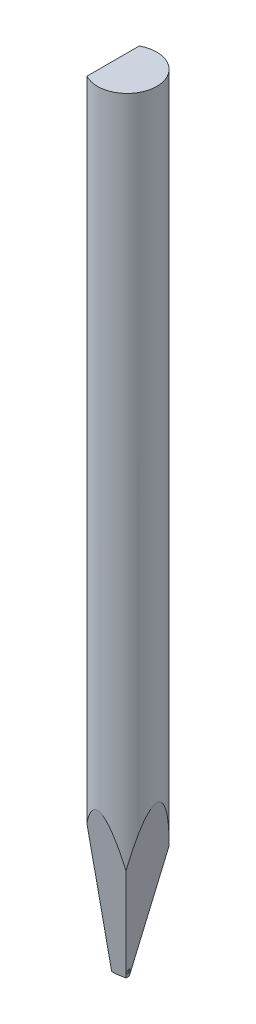
ISO-10303-21;
HEADER;
FILE_DESCRIPTION(('STEP AP214'),'2;1');
FILE_NAME('part.step','',(''),(''),'','','');
FILE_SCHEMA(('AUTOMOTIVE_DESIGN { 1 0 10303 214 1 1 1 1 }'));
ENDSEC;
DATA;
#1=APPLICATION_CONTEXT('core data for automotive mechanical design processes');
#2=APPLICATION_PROTOCOL_DEFINITION('international standard','automotive_design',2000,#1);
#3=PRODUCT_CONTEXT('',#1,'mechanical');
#4=PRODUCT('Part','Part','',(#3));
#5=PRODUCT_RELATED_PRODUCT_CATEGORY('part','',(#4));
#6=PRODUCT_DEFINITION_FORMATION('','',#4);
#7=PRODUCT_DEFINITION_CONTEXT('part definition',#1,'design');
#8=PRODUCT_DEFINITION('design','',#6,#7);
#9=PRODUCT_DEFINITION_SHAPE('','',#8);
#10=(LENGTH_UNIT() NAMED_UNIT(*) SI_UNIT(.MILLI.,.METRE.));
#11=(NAMED_UNIT(*) PLANE_ANGLE_UNIT() SI_UNIT($,.RADIAN.));
#12=(NAMED_UNIT(*) SI_UNIT($,.STERADIAN.) SOLID_ANGLE_UNIT());
#13=UNCERTAINTY_MEASURE_WITH_UNIT(LENGTH_MEASURE(1.E-05),#10,'distance_accuracy_value','');
#14=(GEOMETRIC_REPRESENTATION_CONTEXT(3) GLOBAL_UNCERTAINTY_ASSIGNED_CONTEXT((#13)) GLOBAL_UNIT_ASSIGNED_CONTEXT((#10,
#11,#12)) REPRESENTATION_CONTEXT('',''));
#15=CARTESIAN_POINT('',(0.,0.,0.));
#16=DIRECTION('',(0.,0.,1.));
#17=DIRECTION('',(1.,0.,0.));
#18=AXIS2_PLACEMENT_3D('',#15,#16,#17);
#19=CARTESIAN_POINT('',(0.,21.0312,0.));
#20=DIRECTION('',(0.,-1.,0.));
#21=DIRECTION('',(0.,0.,-1.));
#22=AXIS2_PLACEMENT_3D('',#19,#20,#21);
#23=CYLINDRICAL_SURFACE('',#22,0.792479999999998);
#24=CARTESIAN_POINT('',(0.,-0.201670781505604,0.));
#25=DIRECTION('',(0.,-0.173648177666931,0.984807753012208));
#26=DIRECTION('',(0.,-0.984807753012208,-0.173648177666931));
#27=AXIS2_PLACEMENT_3D('',#24,#25,#26);
#28=ELLIPSE('',#27,4.56371043248163,0.792479999999998);
#29=CARTESIAN_POINT('',(0.544920706940428,3.06158878676079,0.575400706940426));
#30=VERTEX_POINT('',#29);
#31=CARTESIAN_POINT('',(-0.37592,3.75487126564512,0.69764511322018));
#32=VERTEX_POINT('',#31);
#33=EDGE_CURVE('E277',#30,#32,#28,.T.);
#34=ORIENTED_EDGE('',*,*,#33,.F.);
#35=CARTESIAN_POINT('',(0.,-0.0288101116436568,0.));
#36=DIRECTION('',(-0.984807753012208,0.173648177666931,0.));
#37=DIRECTION('',(-0.173648177666931,-0.984807753012208,0.));
#38=AXIS2_PLACEMENT_3D('',#35,#36,#37);
#39=ELLIPSE('',#38,4.56371043248164,0.792479999999998);
#40=CARTESIAN_POINT('',(0.544920706940428,3.06158878676079,-0.575400706940426));
#41=VERTEX_POINT('',#40);
#42=EDGE_CURVE('E280',#30,#41,#39,.T.);
#43=ORIENTED_EDGE('',*,*,#42,.T.);
#44=CARTESIAN_POINT('',(0.,-0.201670781505604,0.));
#45=DIRECTION('',(0.,-0.173648177666931,-0.984807753012208));
#46=DIRECTION('',(0.,-0.984807753012208,0.173648177666931));
#47=AXIS2_PLACEMENT_3D('',#44,#45,#46);
#48=ELLIPSE('',#47,4.56371043248163,0.792479999999998);
#49=CARTESIAN_POINT('',(-0.37592,3.75487126564511,-0.69764511322018));
#50=VERTEX_POINT('',#49);
#51=EDGE_CURVE('E285',#50,#41,#48,.T.);
#52=ORIENTED_EDGE('',*,*,#51,.F.);
#53=DIRECTION('',(0.,-1.,0.));
#54=VECTOR('',#53,1.);
#55=CARTESIAN_POINT('',(-0.37592,21.0312,-0.69764511322018));
#56=LINE('',#55,#54);
#57=CARTESIAN_POINT('',(-0.37592,21.0312,-0.69764511322018));
#58=VERTEX_POINT('',#57);
#59=EDGE_CURVE('E302',#58,#50,#56,.T.);
#60=ORIENTED_EDGE('',*,*,#59,.F.);
#61=CARTESIAN_POINT('',(0.,21.0312,0.));
#62=DIRECTION('',(0.,1.,0.));
#63=DIRECTION('',(0.,0.,1.));
#64=AXIS2_PLACEMENT_3D('',#61,#62,#63);
#65=CIRCLE('',#64,0.792479999999998);
#66=CARTESIAN_POINT('',(-0.37592,21.0312,0.69764511322018));
#67=VERTEX_POINT('',#66);
#68=EDGE_CURVE('E305',#67,#58,#65,.T.);
#69=ORIENTED_EDGE('',*,*,#68,.F.);
#70=DIRECTION('',(0.,-1.,0.));
#71=VECTOR('',#70,1.);
#72=CARTESIAN_POINT('',(-0.37592,21.0312,0.69764511322018));
#73=LINE('',#72,#71);
#74=EDGE_CURVE('E283',#32,#67,#73,.F.);
#75=ORIENTED_EDGE('',*,*,#74,.F.);
#76=EDGE_LOOP('',(#34,#43,#52,#60,#69,#75));
#77=FACE_BOUND('',#76,.T.);
#78=ADVANCED_FACE('F46',(#77),#23,.T.);
#79=CARTESIAN_POINT('',(-0.37592,21.0312,-0.80247998));
#80=DIRECTION('',(-1.,0.,0.));
#81=DIRECTION('',(0.,0.,1.));
#82=AXIS2_PLACEMENT_3D('',#79,#80,#81);
#83=PLANE('',#82);
#84=DIRECTION('',(0.,-0.984807753012208,0.173648177666931));
#85=VECTOR('',#84,1.);
#86=CARTESIAN_POINT('',(-0.37592,20.5281827638758,-3.65523248618578));
#87=LINE('',#86,#85);
#88=CARTESIAN_POINT('',(-0.375919999999999,0.,-0.0355486570961345));
#89=VERTEX_POINT('',#88);
#90=EDGE_CURVE('E311',#50,#89,#87,.T.);
#91=ORIENTED_EDGE('',*,*,#90,.T.);
#92=CARTESIAN_POINT('',(-0.37592,0.,0.0355373141922684));
#93=CARTESIAN_POINT('',(-0.37592,0.0123359586796348,0.0261254448351633));
#94=CARTESIAN_POINT('',(-0.37592,0.0241300000000007,0.013381408455424));
#95=CARTESIAN_POINT('',(-0.37592,0.0241300000000007,-0.0133814084554238));
#96=CARTESIAN_POINT('',(-0.37592,0.0123359586796344,-0.026125444835163));
#97=CARTESIAN_POINT('',(-0.37592,0.,-0.0355373141922685));
#98=(BOUNDED_CURVE() B_SPLINE_CURVE(3,(#92,#93,#94,#95,#96,#97),.UNSPECIFIED.,.F.,
.F.) B_SPLINE_CURVE_WITH_KNOTS((4,2,4),(1.35718974229686,1.5707963267949,1.78440291129293),
.UNSPECIFIED.) CURVE() GEOMETRIC_REPRESENTATION_ITEM() RATIONAL_B_SPLINE_CURVE((1.,1.,1.,1.,1.,1.)) REPRESENTATION_ITEM(''));
#99=CARTESIAN_POINT('',(-0.375919999999998,0.,0.0355486570961342));
#100=VERTEX_POINT('',#99);
#101=EDGE_CURVE('E12',#89,#100,#98,.F.);
#102=ORIENTED_EDGE('',*,*,#101,.T.);
#103=DIRECTION('',(0.,0.984807753012208,0.173648177666931));
#104=VECTOR('',#103,1.);
#105=CARTESIAN_POINT('',(-0.37592,20.2537184461002,3.60683702172021));
#106=LINE('',#105,#104);
#107=EDGE_CURVE('E308',#100,#32,#106,.T.);
#108=ORIENTED_EDGE('',*,*,#107,.T.);
#109=ORIENTED_EDGE('',*,*,#74,.T.);
#110=DIRECTION('',(0.,0.,-1.));
#111=VECTOR('',#110,1.);
#112=CARTESIAN_POINT('',(-0.37592,21.0312,-0.80247998));
#113=LINE('',#112,#111);
#114=EDGE_CURVE('E299',#67,#58,#113,.T.);
#115=ORIENTED_EDGE('',*,*,#114,.T.);
#116=ORIENTED_EDGE('',*,*,#59,.T.);
#117=EDGE_LOOP('',(#91,#102,#108,#109,#115,#116));
#118=FACE_BOUND('',#117,.T.);
#119=ADVANCED_FACE('F253',(#118),#83,.T.);
#120=CARTESIAN_POINT('',(0.,21.0312,0.));
#121=DIRECTION('',(0.,1.,0.));
#122=DIRECTION('',(0.,0.,1.));
#123=AXIS2_PLACEMENT_3D('',#120,#121,#122);
#124=PLANE('',#123);
#125=ORIENTED_EDGE('',*,*,#68,.T.);
#126=ORIENTED_EDGE('',*,*,#114,.F.);
#127=EDGE_LOOP('',(#125,#126));
#128=FACE_BOUND('',#127,.T.);
#129=ADVANCED_FACE('F263',(#128),#124,.T.);
#130=CARTESIAN_POINT('',(26.8738719491216,0.,0.03556));
#131=DIRECTION('',(0.,-0.173648177666931,0.984807753012208));
#132=DIRECTION('',(0.,-0.984807753012208,-0.173648177666931));
#133=AXIS2_PLACEMENT_3D('',#130,#131,#132);
#134=PLANE('',#133);
#135=DIRECTION('',(-0.984346441568213,-0.173566836012845,-0.0306045161452665));
#136=VECTOR('',#135,1.);
#137=CARTESIAN_POINT('',(26.0308292513306,4.63696393297968,0.853181849956361));
#138=LINE('',#137,#136);
#139=CARTESIAN_POINT('',(0.0138011175017547,0.0494599151344343,0.0442811175017518));
#140=VERTEX_POINT('',#139);
#141=CARTESIAN_POINT('',(-0.266700000000001,0.,0.0355486570961342));
#142=VERTEX_POINT('',#141);
#143=EDGE_CURVE('E75',#140,#142,#138,.T.);
#144=ORIENTED_EDGE('',*,*,#143,.F.);
#145=DIRECTION('',(-0.171087869746036,-0.970287525247814,-0.171087869746036));
#146=VECTOR('',#145,1.);
#147=CARTESIAN_POINT('',(0.791557999082992,4.46033837772866,0.822037999082991));
#148=LINE('',#147,#146);
#149=EDGE_CURVE('E290',#30,#140,#148,.T.);
#150=ORIENTED_EDGE('',*,*,#149,.F.);
#151=ORIENTED_EDGE('',*,*,#33,.T.);
#152=ORIENTED_EDGE('',*,*,#107,.F.);
#153=CARTESIAN_POINT('',(-0.266700000000002,0.,0.0355373141922684));
#154=DIRECTION('',(-1.,0.,0.));
#155=VECTOR('',#154,1.);
#156=LINE('',#153,#155);
#157=EDGE_CURVE('E331',#142,#100,#156,.T.);
#158=ORIENTED_EDGE('',*,*,#157,.F.);
#159=EDGE_LOOP('',(#144,#150,#151,#152,#158));
#160=FACE_BOUND('',#159,.T.);
#161=ADVANCED_FACE('F268',(#160),#134,.T.);
#162=CARTESIAN_POINT('',(26.8738719491216,0.,-0.03556));
#163=DIRECTION('',(0.,-0.173648177666931,-0.984807753012208));
#164=DIRECTION('',(0.,0.984807753012208,-0.173648177666931));
#165=AXIS2_PLACEMENT_3D('',#162,#163,#164);
#166=PLANE('',#165);
#167=DIRECTION('',(0.984346441568213,0.173566836012845,-0.0306045161452665));
#168=VECTOR('',#167,1.);
#169=CARTESIAN_POINT('',(26.0308292513306,4.63696393297968,-0.853181849956361));
#170=LINE('',#169,#168);
#171=CARTESIAN_POINT('',(-0.266700000000003,0.,-0.0355486570961342));
#172=VERTEX_POINT('',#171);
#173=CARTESIAN_POINT('',(0.0138011175017547,0.0494599151344343,-0.0442811175017518));
#174=VERTEX_POINT('',#173);
#175=EDGE_CURVE('E310',#172,#174,#170,.T.);
#176=ORIENTED_EDGE('',*,*,#175,.F.);
#177=CARTESIAN_POINT('',(-0.266699999999998,0.,-0.0355600000000001));
#178=DIRECTION('',(-1.,0.,0.));
#179=VECTOR('',#178,1.);
#180=LINE('',#177,#179);
#181=EDGE_CURVE('E286',#172,#89,#180,.T.);
#182=ORIENTED_EDGE('',*,*,#181,.T.);
#183=ORIENTED_EDGE('',*,*,#90,.F.);
#184=ORIENTED_EDGE('',*,*,#51,.T.);
#185=DIRECTION('',(0.171087869746036,0.970287525247814,-0.171087869746036));
#186=VECTOR('',#185,1.);
#187=CARTESIAN_POINT('',(0.791557999082992,4.46033837772866,-0.822037999082991));
#188=LINE('',#187,#186);
#189=EDGE_CURVE('E292',#174,#41,#188,.T.);
#190=ORIENTED_EDGE('',*,*,#189,.F.);
#191=EDGE_LOOP('',(#176,#182,#183,#184,#190));
#192=FACE_BOUND('',#191,.T.);
#193=ADVANCED_FACE('F264',(#192),#166,.T.);
#194=CARTESIAN_POINT('',(-0.2667,0.,27.2760283406468));
#195=DIRECTION('',(-0.173648177666931,0.984807753012208,0.));
#196=DIRECTION('',(-0.984807753012208,-0.173648177666931,0.));
#197=AXIS2_PLACEMENT_3D('',#194,#195,#196);
#198=PLANE('',#197);
#199=CARTESIAN_POINT('',(-1.19582610050797,-0.16383,0.));
#200=DIRECTION('',(-0.173648177666931,0.984807753012208,0.));
#201=DIRECTION('',(-0.984807753012208,-0.173648177666931,0.));
#202=AXIS2_PLACEMENT_3D('',#199,#200,#201);
#203=ELLIPSE('',#202,0.965400283794194,0.16764);
#204=CARTESIAN_POINT('',(-0.258999947357658,0.00135772703372089,0.0285689418325727));
#205=VERTEX_POINT('',#204);
#206=EDGE_CURVE('E218',#142,#205,#203,.T.);
#207=ORIENTED_EDGE('',*,*,#206,.T.);
#208=CARTESIAN_POINT('',(-0.258243544387116,0.00149110128571495,0.));
#209=DIRECTION('',(-0.173648177666931,0.984807753012208,0.));
#210=DIRECTION('',(-0.984807753012208,-0.173648177666931,0.));
#211=AXIS2_PLACEMENT_3D('',#208,#209,#210);
#212=ELLIPSE('',#211,0.03730201329267,0.028575);
#213=CARTESIAN_POINT('',(-0.258243544387116,0.00149110128571495,0.0285749999999997));
#214=VERTEX_POINT('',#213);
#215=EDGE_CURVE('E67',#205,#214,#212,.T.);
#216=ORIENTED_EDGE('',*,*,#215,.T.);
#217=DIRECTION('',(-0.984807753012208,-0.173648177666931,0.));
#218=VECTOR('',#217,1.);
#219=CARTESIAN_POINT('',(-0.2667,0.,0.0285749999999994));
#220=LINE('',#219,#218);
#221=CARTESIAN_POINT('',(-0.1016,0.0291115845149677,0.0285749999999997));
#222=VERTEX_POINT('',#221);
#223=EDGE_CURVE('E229',#222,#214,#220,.T.);
#224=ORIENTED_EDGE('',*,*,#223,.F.);
#225=DIRECTION('',(0.,0.,1.));
#226=VECTOR('',#225,1.);
#227=CARTESIAN_POINT('',(-0.1016,0.0291115845149677,27.2760283406468));
#228=LINE('',#227,#226);
#229=CARTESIAN_POINT('',(-0.1016,0.0291115845149677,-0.0285749999999997));
#230=VERTEX_POINT('',#229);
#231=EDGE_CURVE('E227',#230,#222,#228,.T.);
#232=ORIENTED_EDGE('',*,*,#231,.F.);
#233=DIRECTION('',(-0.984807753012208,-0.173648177666931,0.));
#234=VECTOR('',#233,1.);
#235=CARTESIAN_POINT('',(-0.2667,0.,-0.0285749999999994));
#236=LINE('',#235,#234);
#237=CARTESIAN_POINT('',(-0.258243544387116,0.00149110128571494,-0.0285749999999997));
#238=VERTEX_POINT('',#237);
#239=EDGE_CURVE('E217',#230,#238,#236,.T.);
#240=ORIENTED_EDGE('',*,*,#239,.T.);
#241=CARTESIAN_POINT('',(-0.258999947357658,0.00135772703372088,-0.0285689418325727));
#242=VERTEX_POINT('',#241);
#243=EDGE_CURVE('E178',#238,#242,#212,.T.);
#244=ORIENTED_EDGE('',*,*,#243,.T.);
#245=EDGE_CURVE('E219',#242,#172,#203,.T.);
#246=ORIENTED_EDGE('',*,*,#245,.T.);
#247=ORIENTED_EDGE('',*,*,#175,.T.);
#248=DIRECTION('',(0.,0.,-1.));
#249=VECTOR('',#248,1.);
#250=CARTESIAN_POINT('',(0.0138011175017517,0.0494599151344345,27.2760283406468));
#251=LINE('',#250,#249);
#252=EDGE_CURVE('E224',#140,#174,#251,.T.);
#253=ORIENTED_EDGE('',*,*,#252,.F.);
#254=ORIENTED_EDGE('',*,*,#143,.T.);
#255=EDGE_LOOP('',(#207,#216,#224,#232,#240,#244,#246,#247,#253,#254));
#256=FACE_BOUND('',#255,.T.);
#257=ADVANCED_FACE('F343',(#256),#198,.F.);
#258=CARTESIAN_POINT('',(0.0138011175017517,0.0494599151344345,27.2760283406468));
#259=DIRECTION('',(-0.984807753012208,0.173648177666931,0.));
#260=DIRECTION('',(-0.173648177666931,-0.984807753012208,0.));
#261=AXIS2_PLACEMENT_3D('',#258,#259,#260);
#262=PLANE('',#261);
#263=CARTESIAN_POINT('',(0.0390400044868745,0.192596756040547,0.));
#264=DIRECTION('',(-0.984807753012208,0.173648177666931,0.));
#265=DIRECTION('',(0.173648177666931,0.984807753012208,0.));
#266=AXIS2_PLACEMENT_3D('',#263,#264,#265);
#267=ELLIPSE('',#266,0.0566555398592854,0.04069486264531);
#268=CARTESIAN_POINT('',(0.0488781357381756,0.248391570945063,0.));
#269=VERTEX_POINT('',#268);
#270=EDGE_CURVE('E221',#269,#269,#267,.F.);
#271=ORIENTED_EDGE('',*,*,#270,.F.);
#272=EDGE_LOOP('',(#271));
#273=FACE_BOUND('',#272,.T.);
#274=ORIENTED_EDGE('',*,*,#42,.F.);
#275=ORIENTED_EDGE('',*,*,#149,.T.);
#276=ORIENTED_EDGE('',*,*,#252,.T.);
#277=ORIENTED_EDGE('',*,*,#189,.T.);
#278=EDGE_LOOP('',(#274,#275,#276,#277));
#279=FACE_BOUND('',#278,.T.);
#280=ADVANCED_FACE('F198',(#273,#279),#262,.F.);
#281=CARTESIAN_POINT('',(26.7373469491216,-0.16383,0.));
#282=DIRECTION('',(-1.,0.,0.));
#283=DIRECTION('',(0.,0.,1.));
#284=AXIS2_PLACEMENT_3D('',#281,#282,#283);
#285=CYLINDRICAL_SURFACE('',#284,0.16764);
#286=ORIENTED_EDGE('',*,*,#157,.T.);
#287=CARTESIAN_POINT('',(-0.37592,0.,-0.0355373141922685));
#288=CARTESIAN_POINT('',(-0.365756940225437,0.00252981156072762,-0.0238746706466237));
#289=CARTESIAN_POINT('',(-0.355600000000001,0.00381000000000001,-0.0119362651530878));
#290=CARTESIAN_POINT('',(-0.355600000000001,0.00381,0.0119362651530881));
#291=CARTESIAN_POINT('',(-0.365756940225437,0.00252981156072763,0.0238746706466237));
#292=CARTESIAN_POINT('',(-0.37592,0.,0.0355373141922684));
#293=(BOUNDED_CURVE() B_SPLINE_CURVE(3,(#287,#288,#289,#290,#291,#292),.UNSPECIFIED.,.F.,
.F.) B_SPLINE_CURVE_WITH_KNOTS((4,2,4),(1.35718974229686,1.5707963267949,1.78440291129293),
.UNSPECIFIED.) CURVE() GEOMETRIC_REPRESENTATION_ITEM() RATIONAL_B_SPLINE_CURVE((1.,1.,1.,1.,1.,1.)) REPRESENTATION_ITEM(''));
#294=EDGE_CURVE('E60',#100,#89,#293,.F.);
#295=ORIENTED_EDGE('',*,*,#294,.T.);
#296=ORIENTED_EDGE('',*,*,#181,.F.);
#297=ORIENTED_EDGE('',*,*,#245,.F.);
#298=CARTESIAN_POINT('',(-0.258321153032181,0.00135667916935597,-0.028575));
#299=CARTESIAN_POINT('',(-0.260276016032886,0.00135549010679179,-0.0285758852426813));
#300=CARTESIAN_POINT('',(-0.262234112851868,0.00138265361465948,-0.0284245171298137));
#301=CARTESIAN_POINT('',(-0.266108420273467,0.00148848628630186,-0.0278057782951339));
#302=CARTESIAN_POINT('',(-0.268024355171941,0.00156742660689821,-0.0273367435189977));
#303=CARTESIAN_POINT('',(-0.271751015657956,0.00177189061101245,-0.0260685953138944));
#304=CARTESIAN_POINT('',(-0.273561323642345,0.00189758638097326,-0.0252682612730123));
#305=CARTESIAN_POINT('',(-0.276993627827201,0.00217970311372503,-0.0233429438240902));
#306=CARTESIAN_POINT('',(-0.278616080852129,0.00233604693969147,-0.0222187722012887));
#307=CARTESIAN_POINT('',(-0.281446980118634,0.00264029455893613,-0.0198022043642483));
#308=CARTESIAN_POINT('',(-0.282680966193792,0.00278737504971626,-0.0185396301118562));
#309=CARTESIAN_POINT('',(-0.284892603054166,0.00306896740801353,-0.0158046230162948));
#310=CARTESIAN_POINT('',(-0.285870280449885,0.00320348057936203,-0.0143322119833399));
#311=CARTESIAN_POINT('',(-0.28744842183451,0.00342973214679563,-0.0113728074118369));
#312=CARTESIAN_POINT('',(-0.288075794624674,0.0035243108950538,-0.00990033032672132));
#313=CARTESIAN_POINT('',(-0.289062998769044,0.00367617584883746,-0.0068666855962334));
#314=CARTESIAN_POINT('',(-0.289422949909698,0.00373347874993789,-0.00530555799790294));
#315=CARTESIAN_POINT('',(-0.289852130828568,0.0038021104321895,-0.00221778661601703));
#316=CARTESIAN_POINT('',(-0.289934201796683,0.00381546905693404,-0.00069295859014958));
#317=CARTESIAN_POINT('',(-0.289841052870919,0.00380044330784583,0.00234855158658356));
#318=CARTESIAN_POINT('',(-0.289665858252187,0.00377206303466519,0.00386523452297412));
#319=CARTESIAN_POINT('',(-0.28906773592939,0.00367736769845005,0.00682813336830946));
#320=CARTESIAN_POINT('',(-0.288647871660998,0.00361152196561023,0.00827498522016942));
#321=CARTESIAN_POINT('',(-0.287576494113354,0.00344945595776708,0.0110781886439269));
#322=CARTESIAN_POINT('',(-0.286924980343119,0.00335323561838436,0.0124345400240001));
#323=CARTESIAN_POINT('',(-0.285400257950125,0.00313912804717932,0.0150404790921165));
#324=CARTESIAN_POINT('',(-0.2845240106258,0.00302095049717239,0.0162882614852322));
#325=CARTESIAN_POINT('',(-0.28258266095967,0.00277623786791645,0.0186256602535481));
#326=CARTESIAN_POINT('',(-0.281517538757082,0.00264970191063373,0.0197152599734119));
#327=CARTESIAN_POINT('',(-0.279179864463867,0.00239512804285125,0.021759753672124));
#328=CARTESIAN_POINT('',(-0.277900207238726,0.0022672724615332,0.022706528998981));
#329=CARTESIAN_POINT('',(-0.275208604421468,0.00202830311072977,0.0243909682856375));
#330=CARTESIAN_POINT('',(-0.273796596970596,0.00191719723375257,0.025128533808584));
#331=CARTESIAN_POINT('',(-0.270759060507803,0.00171314034448678,0.0264407723663028));
#332=CARTESIAN_POINT('',(-0.269125513852903,0.00162241854167639,0.0269971800617795));
#333=CARTESIAN_POINT('',(-0.265793765494127,0.001479241218882,0.0278608442521307));
#334=CARTESIAN_POINT('',(-0.264095586514163,0.00142677237804831,0.0281681874830211));
#335=CARTESIAN_POINT('',(-0.261034898327654,0.00136915560301108,0.028502593793475));
#336=CARTESIAN_POINT('',(-0.259677403407162,0.00135634338877993,0.0285752056592244));
#337=CARTESIAN_POINT('',(-0.258321153032192,0.00135667916934232,0.0285750000000952));
#338=B_SPLINE_CURVE_WITH_KNOTS('',3,(#298,#299,#300,#301,#302,#303,#304,#305,#306,#307,#308,
#309,#310,#311,#312,#313,#314,#315,#316,#317,#318,#319,#320,#321,#322,#323,#324,#325,#326,#327,
#328,#329,#330,#331,#332,#333,#334,#335,#336,#337),.UNSPECIFIED.,.F.,.F.,(4,2,2,2,2,2,2,2,2,2,2,
2,2,2,2,2,2,2,2,4),(0.,0.00586353999662004,0.0117580353898794,0.0176744440479204,
0.0235761488224096,0.0288616194957563,0.0341465412029689,0.0389322289799351,0.043715771804364,
0.0482750016519236,0.0528337836063291,0.0573366767938879,0.0618395795254539,0.0664069113144767,
0.0709747236577876,0.0757451440298436,0.0805178052584395,0.0856809628413365,0.090842321595161,
0.0949114452939571),.UNSPECIFIED.);
#339=EDGE_CURVE('E210',#242,#205,#338,.T.);
#340=ORIENTED_EDGE('',*,*,#339,.T.);
#341=ORIENTED_EDGE('',*,*,#206,.F.);
#342=EDGE_LOOP('',(#286,#295,#296,#297,#340,#341));
#343=FACE_BOUND('',#342,.T.);
#344=ADVANCED_FACE('F188',(#343),#285,.F.);
#345=CARTESIAN_POINT('',(-0.1016,0.0939800000000001,0.028575));
#346=DIRECTION('',(-1.,0.,0.));
#347=DIRECTION('',(0.,0.,1.));
#348=AXIS2_PLACEMENT_3D('',#345,#346,#347);
#349=PLANE('',#348);
#350=ORIENTED_EDGE('',*,*,#231,.T.);
#351=DIRECTION('',(0.,1.,0.));
#352=VECTOR('',#351,1.);
#353=CARTESIAN_POINT('',(-0.1016,0.0939800000000001,0.028575));
#354=LINE('',#353,#352);
#355=CARTESIAN_POINT('',(-0.1016,0.0939800000000001,0.028575));
#356=VERTEX_POINT('',#355);
#357=EDGE_CURVE('E164',#222,#356,#354,.T.);
#358=ORIENTED_EDGE('',*,*,#357,.T.);
#359=DIRECTION('',(0.,0.,-1.));
#360=VECTOR('',#359,1.);
#361=CARTESIAN_POINT('',(-0.1016,0.0939800000000001,0.028575));
#362=LINE('',#361,#360);
#363=CARTESIAN_POINT('',(-0.1016,0.0939800000000001,0.0254));
#364=VERTEX_POINT('',#363);
#365=EDGE_CURVE('E151',#356,#364,#362,.T.);
#366=ORIENTED_EDGE('',*,*,#365,.T.);
#367=CARTESIAN_POINT('',(-0.1016,0.0939800000000001,0.));
#368=DIRECTION('',(1.,0.,0.));
#369=DIRECTION('',(0.,1.,0.));
#370=AXIS2_PLACEMENT_3D('',#367,#368,#369);
#371=ELLIPSE('',#370,0.0293293936748329,0.0254);
#372=CARTESIAN_POINT('',(-0.1016,0.0939800000000001,-0.0253999999999914));
#373=VERTEX_POINT('',#372);
#374=EDGE_CURVE('E143',#373,#364,#371,.F.);
#375=ORIENTED_EDGE('',*,*,#374,.F.);
#376=CARTESIAN_POINT('',(-0.1016,0.0939800000000001,-0.028575));
#377=VERTEX_POINT('',#376);
#378=EDGE_CURVE('E148',#373,#377,#362,.T.);
#379=ORIENTED_EDGE('',*,*,#378,.T.);
#380=DIRECTION('',(0.,1.,0.));
#381=VECTOR('',#380,1.);
#382=CARTESIAN_POINT('',(-0.1016,0.0939800000000001,-0.028575));
#383=LINE('',#382,#381);
#384=EDGE_CURVE('E171',#230,#377,#383,.T.);
#385=ORIENTED_EDGE('',*,*,#384,.F.);
#386=EDGE_LOOP('',(#350,#358,#366,#375,#379,#385));
#387=FACE_BOUND('',#386,.T.);
#388=ADVANCED_FACE('F145',(#387),#349,.T.);
#389=CARTESIAN_POINT('',(0.,0.,0.028575));
#390=DIRECTION('',(0.,0.,-1.));
#391=DIRECTION('',(-1.,0.,0.));
#392=AXIS2_PLACEMENT_3D('',#389,#390,#391);
#393=PLANE('',#392);
#394=ORIENTED_EDGE('',*,*,#223,.T.);
#395=DIRECTION('',(-0.500000000000004,-0.866025403784436,0.));
#396=VECTOR('',#395,1.);
#397=CARTESIAN_POINT('',(-0.194328324086859,0.112195510222718,0.028575));
#398=LINE('',#397,#396);
#399=CARTESIAN_POINT('',(-0.204845053817371,0.0939800000000001,0.028575));
#400=VERTEX_POINT('',#399);
#401=EDGE_CURVE('E166',#400,#214,#398,.T.);
#402=ORIENTED_EDGE('',*,*,#401,.F.);
#403=DIRECTION('',(-1.,0.,0.));
#404=VECTOR('',#403,1.);
#405=CARTESIAN_POINT('',(-0.237840621701558,0.0939800000000001,0.028575));
#406=LINE('',#405,#404);
#407=EDGE_CURVE('E167',#356,#400,#406,.T.);
#408=ORIENTED_EDGE('',*,*,#407,.F.);
#409=ORIENTED_EDGE('',*,*,#357,.F.);
#410=EDGE_LOOP('',(#394,#402,#408,#409));
#411=FACE_BOUND('',#410,.T.);
#412=ADVANCED_FACE('F380',(#411),#393,.T.);
#413=CARTESIAN_POINT('',(0.,0.,-0.028575));
#414=DIRECTION('',(0.,0.,-1.));
#415=DIRECTION('',(-1.,0.,0.));
#416=AXIS2_PLACEMENT_3D('',#413,#414,#415);
#417=PLANE('',#416);
#418=ORIENTED_EDGE('',*,*,#384,.T.);
#419=DIRECTION('',(-1.,0.,0.));
#420=VECTOR('',#419,1.);
#421=CARTESIAN_POINT('',(-0.237840621701558,0.0939800000000001,-0.028575));
#422=LINE('',#421,#420);
#423=CARTESIAN_POINT('',(-0.204845053817371,0.0939800000000001,-0.028575));
#424=VERTEX_POINT('',#423);
#425=EDGE_CURVE('E153',#377,#424,#422,.T.);
#426=ORIENTED_EDGE('',*,*,#425,.T.);
#427=DIRECTION('',(0.500000000000004,0.866025403784436,0.));
#428=VECTOR('',#427,1.);
#429=CARTESIAN_POINT('',(-0.204845053817371,0.0939800000000001,-0.028575));
#430=LINE('',#429,#428);
#431=EDGE_CURVE('E174',#238,#424,#430,.T.);
#432=ORIENTED_EDGE('',*,*,#431,.F.);
#433=ORIENTED_EDGE('',*,*,#239,.F.);
#434=EDGE_LOOP('',(#418,#426,#432,#433));
#435=FACE_BOUND('',#434,.T.);
#436=ADVANCED_FACE('F383',(#435),#417,.F.);
#437=CARTESIAN_POINT('',(0.008947063391905,0.157804376807438,0.));
#438=DIRECTION('',(0.866025403784441,0.499999999999995,0.));
#439=DIRECTION('',(-0.499999999999995,0.866025403784441,0.));
#440=AXIS2_PLACEMENT_3D('',#437,#438,#439);
#441=CONICAL_SURFACE('',#440,0.0254,0.392699081698725);
#442=CARTESIAN_POINT('',(0.008947063391905,0.157804376807438,0.));
#443=DIRECTION('',(0.866025403784441,0.499999999999995,0.));
#444=DIRECTION('',(-0.499999999999995,0.866025403784441,0.));
#445=AXIS2_PLACEMENT_3D('',#442,#443,#444);
#446=CIRCLE('',#445,0.0254);
#447=CARTESIAN_POINT('',(-0.00375293660809487,0.179801422063563,0.));
#448=VERTEX_POINT('',#447);
#449=EDGE_CURVE('E159',#448,#448,#446,.T.);
#450=ORIENTED_EDGE('',*,*,#449,.F.);
#451=EDGE_LOOP('',(#450));
#452=FACE_BOUND('',#451,.T.);
#453=ORIENTED_EDGE('',*,*,#270,.T.);
#454=EDGE_LOOP('',(#453));
#455=FACE_BOUND('',#454,.T.);
#456=ADVANCED_FACE('F379',(#452,#455),#441,.F.);
#457=CARTESIAN_POINT('',(-0.204845053817371,0.0939800000000001,0.));
#458=DIRECTION('',(-0.500000000000004,-0.866025403784436,0.));
#459=DIRECTION('',(0.866025403784436,-0.500000000000004,0.));
#460=AXIS2_PLACEMENT_3D('',#457,#458,#459);
#461=CYLINDRICAL_SURFACE('',#460,0.028575);
#462=ORIENTED_EDGE('',*,*,#339,.F.);
#463=ORIENTED_EDGE('',*,*,#243,.F.);
#464=ORIENTED_EDGE('',*,*,#431,.T.);
#465=CARTESIAN_POINT('',(-0.204845053817371,0.0939800000000001,0.));
#466=DIRECTION('',(0.,-1.,0.));
#467=DIRECTION('',(-1.,0.,0.));
#468=AXIS2_PLACEMENT_3D('',#465,#466,#467);
#469=ELLIPSE('',#468,0.0329955678841872,0.028575);
#470=EDGE_CURVE('E176',#424,#400,#469,.F.);
#471=ORIENTED_EDGE('',*,*,#470,.T.);
#472=ORIENTED_EDGE('',*,*,#401,.T.);
#473=ORIENTED_EDGE('',*,*,#215,.F.);
#474=EDGE_LOOP('',(#462,#463,#464,#471,#472,#473));
#475=FACE_BOUND('',#474,.T.);
#476=ADVANCED_FACE('F201',(#475),#461,.F.);
#477=CARTESIAN_POINT('',(-0.237840621701558,0.0939800000000001,0.028575));
#478=DIRECTION('',(0.,-1.,0.));
#479=DIRECTION('',(0.,0.,-1.));
#480=AXIS2_PLACEMENT_3D('',#477,#478,#479);
#481=PLANE('',#480);
#482=ORIENTED_EDGE('',*,*,#425,.F.);
#483=ORIENTED_EDGE('',*,*,#378,.F.);
#484=CARTESIAN_POINT('',(-0.1016,0.0939800000000001,0.));
#485=DIRECTION('',(0.,1.,0.));
#486=DIRECTION('',(1.,0.,0.));
#487=AXIS2_PLACEMENT_3D('',#484,#485,#486);
#488=ELLIPSE('',#487,0.0508000000000005,0.0254);
#489=EDGE_CURVE('E154',#364,#373,#488,.F.);
#490=ORIENTED_EDGE('',*,*,#489,.F.);
#491=ORIENTED_EDGE('',*,*,#365,.F.);
#492=ORIENTED_EDGE('',*,*,#407,.T.);
#493=ORIENTED_EDGE('',*,*,#470,.F.);
#494=EDGE_LOOP('',(#482,#483,#490,#491,#492,#493));
#495=FACE_BOUND('',#494,.T.);
#496=ADVANCED_FACE('F161',(#495),#481,.T.);
#497=CARTESIAN_POINT('',(-0.357703694095365,-0.0538815367264147,0.));
#498=DIRECTION('',(0.866025403784441,0.499999999999995,0.));
#499=DIRECTION('',(-0.499999999999995,0.866025403784441,0.));
#500=AXIS2_PLACEMENT_3D('',#497,#498,#499);
#501=CYLINDRICAL_SURFACE('',#500,0.0254);
#502=ORIENTED_EDGE('',*,*,#374,.T.);
#503=ORIENTED_EDGE('',*,*,#489,.T.);
#504=EDGE_LOOP('',(#502,#503));
#505=FACE_BOUND('',#504,.T.);
#506=ORIENTED_EDGE('',*,*,#449,.T.);
#507=EDGE_LOOP('',(#506));
#508=FACE_BOUND('',#507,.T.);
#509=ADVANCED_FACE('F156',(#505,#508),#501,.F.);
#510=CARTESIAN_POINT('',(-0.37592,0.,0.0355373141922684));
#511=CARTESIAN_POINT('',(-0.365756940225437,0.00252981156072763,0.0238746706466237));
#512=CARTESIAN_POINT('',(-0.355600000000001,0.00381,0.0119362651530881));
#513=CARTESIAN_POINT('',(-0.355600000000001,0.00381000000000001,-0.0119362651530878));
#514=CARTESIAN_POINT('',(-0.365756940225437,0.00252981156072762,-0.0238746706466237));
#515=CARTESIAN_POINT('',(-0.37592,0.,-0.0355373141922685));
#516=CARTESIAN_POINT('',(-0.37592,0.,0.0355373141922684));
#517=CARTESIAN_POINT('',(-0.375919999999993,0.00253036332383113,0.0238721239843854));
#518=CARTESIAN_POINT('',(-0.375920000000001,0.00381000000000123,0.0119362651530879));
#519=CARTESIAN_POINT('',(-0.375920000000001,0.00381000000000106,-0.0119362651530877));
#520=CARTESIAN_POINT('',(-0.375919999999994,0.00253036332383165,-0.0238721239843857));
#521=CARTESIAN_POINT('',(-0.37592,0.,-0.0355373141922685));
#522=CARTESIAN_POINT('',(-0.37592,0.,0.0355373141922684));
#523=CARTESIAN_POINT('',(-0.37592,0.0123359586796348,0.0261254448351633));
#524=CARTESIAN_POINT('',(-0.37592,0.0241300000000007,0.013381408455424));
#525=CARTESIAN_POINT('',(-0.37592,0.0241300000000007,-0.0133814084554238));
#526=CARTESIAN_POINT('',(-0.37592,0.0123359586796344,-0.026125444835163));
#527=CARTESIAN_POINT('',(-0.37592,0.,-0.0355373141922685));
#528=(BOUNDED_SURFACE() B_SPLINE_SURFACE(2,3,((#510,#511,#512,#513,#514,#515),(#516,#517,#518,
#519,#520,#521),(#522,#523,#524,#525,#526,#527)),.UNSPECIFIED.,.F.,.F.,
.F.) B_SPLINE_SURFACE_WITH_KNOTS((3,3),(4,2,4),(0.,1.),(1.35718974229686,1.5707963267949,
1.78440291129293),.UNSPECIFIED.) GEOMETRIC_REPRESENTATION_ITEM() RATIONAL_B_SPLINE_SURFACE(((1.,
1.,1.,1.,1.,1.),(0.707106781186548,0.707106781186548,0.707106781186556,0.707106781186556,
0.707106781186548,0.707106781186548),(1.,1.,1.,1.,1.,1.))) REPRESENTATION_ITEM('') SURFACE());
#529=ORIENTED_EDGE('',*,*,#294,.F.);
#530=ORIENTED_EDGE('',*,*,#101,.F.);
#531=EDGE_LOOP('',(#529,#530));
#532=FACE_BOUND('',#531,.T.);
#533=ADVANCED_FACE('F49',(#532),#528,.T.);
#534=CLOSED_SHELL('',(#78,#119,#129,#161,#193,#257,#280,#344,#388,#412,#436,#456,#476,#496,#509,#533));
#535=MANIFOLD_SOLID_BREP('B2',#534);
#536=ADVANCED_BREP_SHAPE_REPRESENTATION('',(#18,#535),#14);
#537=SHAPE_DEFINITION_REPRESENTATION(#9,#536);
ENDSEC;
END-ISO-10303-21;
